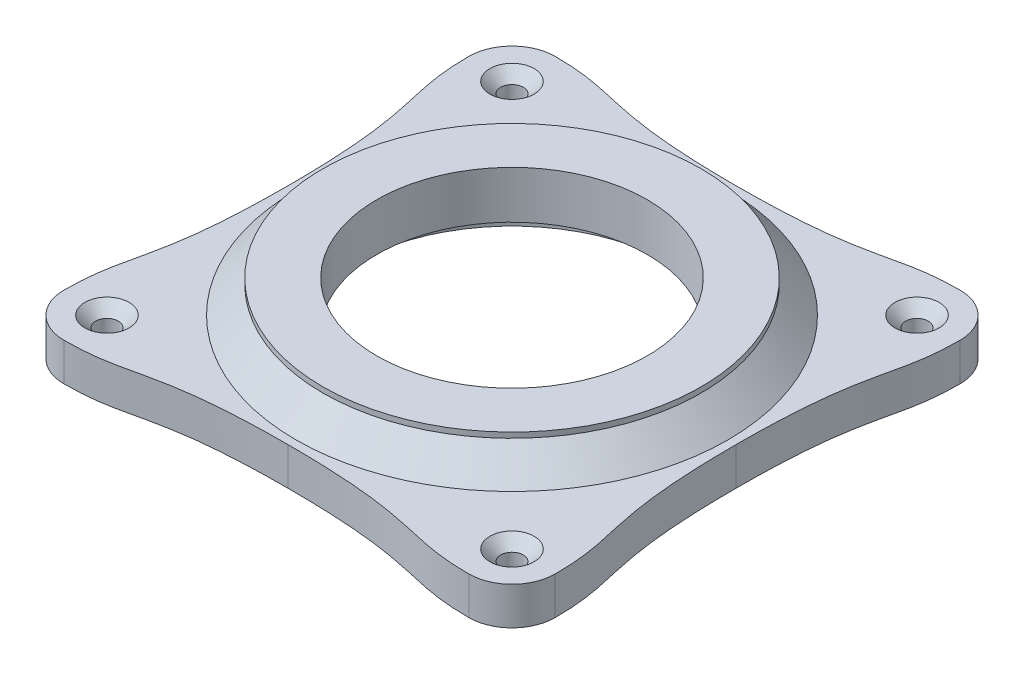
ISO-10303-21;
HEADER;
FILE_DESCRIPTION(('STEP AP214'),'2;1');
FILE_NAME('part.step','',(''),(''),'','','');
FILE_SCHEMA(('AUTOMOTIVE_DESIGN { 1 0 10303 214 1 1 1 1 }'));
ENDSEC;
DATA;
#1=APPLICATION_CONTEXT('core data for automotive mechanical design processes');
#2=APPLICATION_PROTOCOL_DEFINITION('international standard','automotive_design',2000,#1);
#3=PRODUCT_CONTEXT('',#1,'mechanical');
#4=PRODUCT('Part','Part','',(#3));
#5=PRODUCT_RELATED_PRODUCT_CATEGORY('part','',(#4));
#6=PRODUCT_DEFINITION_FORMATION('','',#4);
#7=PRODUCT_DEFINITION_CONTEXT('part definition',#1,'design');
#8=PRODUCT_DEFINITION('design','',#6,#7);
#9=PRODUCT_DEFINITION_SHAPE('','',#8);
#10=(LENGTH_UNIT() NAMED_UNIT(*) SI_UNIT(.MILLI.,.METRE.));
#11=(NAMED_UNIT(*) PLANE_ANGLE_UNIT() SI_UNIT($,.RADIAN.));
#12=(NAMED_UNIT(*) SI_UNIT($,.STERADIAN.) SOLID_ANGLE_UNIT());
#13=UNCERTAINTY_MEASURE_WITH_UNIT(LENGTH_MEASURE(1.E-05),#10,'distance_accuracy_value','');
#14=(GEOMETRIC_REPRESENTATION_CONTEXT(3) GLOBAL_UNCERTAINTY_ASSIGNED_CONTEXT((#13)) GLOBAL_UNIT_ASSIGNED_CONTEXT((#10,
#11,#12)) REPRESENTATION_CONTEXT('',''));
#15=CARTESIAN_POINT('',(0.,0.,0.));
#16=DIRECTION('',(0.,0.,1.));
#17=DIRECTION('',(1.,0.,0.));
#18=AXIS2_PLACEMENT_3D('',#15,#16,#17);
#19=CARTESIAN_POINT('',(0.,7.,0.));
#20=DIRECTION('',(0.,1.,0.));
#21=DIRECTION('',(0.,0.,1.));
#22=AXIS2_PLACEMENT_3D('',#19,#20,#21);
#23=PLANE('',#22);
#24=CARTESIAN_POINT('',(37.5,7.,-37.5));
#25=DIRECTION('',(0.,1.,0.));
#26=DIRECTION('',(0.,0.,1.));
#27=AXIS2_PLACEMENT_3D('',#24,#25,#26);
#28=CIRCLE('',#27,39.9999999999999);
#29=CARTESIAN_POINT('',(37.5,7.,2.49999999999993));
#30=VERTEX_POINT('',#29);
#31=EDGE_CURVE('E11',#30,#30,#28,.F.);
#32=ORIENTED_EDGE('',*,*,#31,.T.);
#33=EDGE_LOOP('',(#32));
#34=FACE_BOUND('',#33,.T.);
#35=CARTESIAN_POINT('',(0.,7.,-75.));
#36=DIRECTION('',(0.,1.,0.));
#37=DIRECTION('',(0.,0.,1.));
#38=AXIS2_PLACEMENT_3D('',#35,#36,#37);
#39=CIRCLE('',#38,4.10000000000002);
#40=CARTESIAN_POINT('',(0.,7.,-70.9));
#41=VERTEX_POINT('',#40);
#42=EDGE_CURVE('E307',#41,#41,#39,.F.);
#43=ORIENTED_EDGE('',*,*,#42,.T.);
#44=EDGE_LOOP('',(#43));
#45=FACE_BOUND('',#44,.T.);
#46=CARTESIAN_POINT('',(0.,7.,0.));
#47=DIRECTION('',(0.,1.,0.));
#48=DIRECTION('',(0.,0.,1.));
#49=AXIS2_PLACEMENT_3D('',#46,#47,#48);
#50=CIRCLE('',#49,4.10000000000006);
#51=CARTESIAN_POINT('',(0.,7.,4.10000000000006));
#52=VERTEX_POINT('',#51);
#53=EDGE_CURVE('E304',#52,#52,#50,.F.);
#54=ORIENTED_EDGE('',*,*,#53,.T.);
#55=EDGE_LOOP('',(#54));
#56=FACE_BOUND('',#55,.T.);
#57=CARTESIAN_POINT('',(75.,7.,0.));
#58=DIRECTION('',(0.,1.,0.));
#59=DIRECTION('',(0.,0.,1.));
#60=AXIS2_PLACEMENT_3D('',#57,#58,#59);
#61=CIRCLE('',#60,4.10000000000006);
#62=CARTESIAN_POINT('',(75.,7.,4.10000000000006));
#63=VERTEX_POINT('',#62);
#64=EDGE_CURVE('E301',#63,#63,#61,.F.);
#65=ORIENTED_EDGE('',*,*,#64,.T.);
#66=EDGE_LOOP('',(#65));
#67=FACE_BOUND('',#66,.T.);
#68=CARTESIAN_POINT('',(75.0000000000007,7.,-75.0000000000004));
#69=DIRECTION('',(0.,1.,0.));
#70=DIRECTION('',(0.,0.,1.));
#71=AXIS2_PLACEMENT_3D('',#68,#69,#70);
#72=CIRCLE('',#71,4.09999999999928);
#73=CARTESIAN_POINT('',(75.0000000000007,7.,-70.9000000000011));
#74=VERTEX_POINT('',#73);
#75=EDGE_CURVE('E298',#74,#74,#72,.F.);
#76=ORIENTED_EDGE('',*,*,#75,.T.);
#77=EDGE_LOOP('',(#76));
#78=FACE_BOUND('',#77,.T.);
#79=CARTESIAN_POINT('',(0.,7.,-75.));
#80=DIRECTION('',(0.,1.,0.));
#81=DIRECTION('',(0.,0.,1.));
#82=AXIS2_PLACEMENT_3D('',#79,#80,#81);
#83=CIRCLE('',#82,8.);
#84=CARTESIAN_POINT('',(0.,7.,-83.));
#85=VERTEX_POINT('',#84);
#86=CARTESIAN_POINT('',(-8.,7.,-75.));
#87=VERTEX_POINT('',#86);
#88=EDGE_CURVE('E385',#85,#87,#83,.T.);
#89=ORIENTED_EDGE('',*,*,#88,.T.);
#90=CARTESIAN_POINT('',(-7.99999999999906,7.,-74.9999999999999));
#91=CARTESIAN_POINT('',(-7.99999999999922,7.,-62.4999999999999));
#92=CARTESIAN_POINT('',(-4.,7.,-62.5));
#93=CARTESIAN_POINT('',(-4.,7.,-37.5));
#94=B_SPLINE_CURVE_WITH_KNOTS('',3,(#90,#91,#92,#93),.UNSPECIFIED.,.F.,.F.,(4,4),(0.,1.),.UNSPECIFIED.);
#95=CARTESIAN_POINT('',(-4.,7.,-37.5));
#96=VERTEX_POINT('',#95);
#97=EDGE_CURVE('E107',#87,#96,#94,.T.);
#98=ORIENTED_EDGE('',*,*,#97,.T.);
#99=CARTESIAN_POINT('',(-7.99999999999987,7.,0.));
#100=CARTESIAN_POINT('',(-7.99999999999974,7.,-12.4999999999999));
#101=CARTESIAN_POINT('',(-4.00000000000002,7.,-12.5));
#102=CARTESIAN_POINT('',(-4.,7.,-37.5));
#103=B_SPLINE_CURVE_WITH_KNOTS('',3,(#99,#100,#101,#102),.UNSPECIFIED.,.F.,.F.,(4,4),(0.,1.),.UNSPECIFIED.);
#104=CARTESIAN_POINT('',(-7.99999999999915,7.,-2.93902320845243E-13));
#105=VERTEX_POINT('',#104);
#106=EDGE_CURVE('E236',#105,#96,#103,.T.);
#107=ORIENTED_EDGE('',*,*,#106,.F.);
#108=CARTESIAN_POINT('',(8.46545056276682E-13,7.,-2.4980018054066E-13));
#109=DIRECTION('',(0.,1.,0.));
#110=DIRECTION('',(0.,0.,1.));
#111=AXIS2_PLACEMENT_3D('',#108,#109,#110);
#112=CIRCLE('',#111,8.);
#113=CARTESIAN_POINT('',(8.46545056276682E-13,7.,7.99999999999975));
#114=VERTEX_POINT('',#113);
#115=EDGE_CURVE('E241',#105,#114,#112,.T.);
#116=ORIENTED_EDGE('',*,*,#115,.T.);
#117=CARTESIAN_POINT('',(7.91033905045424E-13,7.,7.99999999999974));
#118=CARTESIAN_POINT('',(12.5000000000008,7.,7.99999999999985));
#119=CARTESIAN_POINT('',(12.5,7.,4.00000000000005));
#120=CARTESIAN_POINT('',(37.5,7.,4.00000000000003));
#121=B_SPLINE_CURVE_WITH_KNOTS('',3,(#117,#118,#119,#120),.UNSPECIFIED.,.F.,.F.,(4,4),(0.,1.),.UNSPECIFIED.);
#122=CARTESIAN_POINT('',(37.5,7.,4.00000000000003));
#123=VERTEX_POINT('',#122);
#124=EDGE_CURVE('E206',#114,#123,#121,.T.);
#125=ORIENTED_EDGE('',*,*,#124,.T.);
#126=CARTESIAN_POINT('',(75.0000000000008,7.,8.00000000000028));
#127=CARTESIAN_POINT('',(62.5000000000008,7.,8.0000000000002));
#128=CARTESIAN_POINT('',(62.5,7.,4.00000000000003));
#129=CARTESIAN_POINT('',(37.5,7.,4.00000000000003));
#130=B_SPLINE_CURVE_WITH_KNOTS('',3,(#126,#127,#128,#129),.UNSPECIFIED.,.F.,.F.,(4,4),(0.,1.),.UNSPECIFIED.);
#131=CARTESIAN_POINT('',(75.0000000000005,7.,7.99999999999959));
#132=VERTEX_POINT('',#131);
#133=EDGE_CURVE('E200',#132,#123,#130,.T.);
#134=ORIENTED_EDGE('',*,*,#133,.F.);
#135=CARTESIAN_POINT('',(75.0000000000005,7.,-4.02455846426619E-13));
#136=DIRECTION('',(0.,1.,0.));
#137=DIRECTION('',(0.,0.,1.));
#138=AXIS2_PLACEMENT_3D('',#135,#136,#137);
#139=CIRCLE('',#138,7.99999999999999);
#140=CARTESIAN_POINT('',(83.0000000000005,7.,-3.73544278276556E-13));
#141=VERTEX_POINT('',#140);
#142=EDGE_CURVE('E195',#132,#141,#139,.T.);
#143=ORIENTED_EDGE('',*,*,#142,.T.);
#144=CARTESIAN_POINT('',(83.0000000000004,7.,-3.7470027081099E-13));
#145=CARTESIAN_POINT('',(83.0000000000005,7.,-12.5000000000004));
#146=CARTESIAN_POINT('',(79.,7.,-12.5));
#147=CARTESIAN_POINT('',(79.,7.,-37.5));
#148=B_SPLINE_CURVE_WITH_KNOTS('',3,(#144,#145,#146,#147),.UNSPECIFIED.,.F.,.F.,(4,4),(0.,1.),.UNSPECIFIED.);
#149=CARTESIAN_POINT('',(79.,7.,-37.5));
#150=VERTEX_POINT('',#149);
#151=EDGE_CURVE('E187',#141,#150,#148,.T.);
#152=ORIENTED_EDGE('',*,*,#151,.T.);
#153=CARTESIAN_POINT('',(83.0000000000007,7.,-75.0000000000004));
#154=CARTESIAN_POINT('',(83.0000000000007,7.,-62.5000000000004));
#155=CARTESIAN_POINT('',(79.,7.,-62.5));
#156=CARTESIAN_POINT('',(79.,7.,-37.5));
#157=B_SPLINE_CURVE_WITH_KNOTS('',3,(#153,#154,#155,#156),.UNSPECIFIED.,.F.,.F.,(4,4),(0.,1.),.UNSPECIFIED.);
#158=CARTESIAN_POINT('',(83.0000000000002,7.,-75.));
#159=VERTEX_POINT('',#158);
#160=EDGE_CURVE('E141',#159,#150,#157,.T.);
#161=ORIENTED_EDGE('',*,*,#160,.F.);
#162=CARTESIAN_POINT('',(75.0000000000007,7.,-75.0000000000004));
#163=DIRECTION('',(0.,1.,0.));
#164=DIRECTION('',(0.,0.,1.));
#165=AXIS2_PLACEMENT_3D('',#162,#163,#164);
#166=CIRCLE('',#165,7.99999999999945);
#167=CARTESIAN_POINT('',(75.,7.,-82.9999999999999));
#168=VERTEX_POINT('',#167);
#169=EDGE_CURVE('E135',#159,#168,#166,.T.);
#170=ORIENTED_EDGE('',*,*,#169,.T.);
#171=CARTESIAN_POINT('',(75.,7.,-83.));
#172=CARTESIAN_POINT('',(62.5,7.,-83.));
#173=CARTESIAN_POINT('',(62.5,7.,-79.));
#174=CARTESIAN_POINT('',(37.5,7.,-79.));
#175=B_SPLINE_CURVE_WITH_KNOTS('',3,(#171,#172,#173,#174),.UNSPECIFIED.,.F.,.F.,(4,4),(0.,1.),.UNSPECIFIED.);
#176=CARTESIAN_POINT('',(37.5,7.,-79.));
#177=VERTEX_POINT('',#176);
#178=EDGE_CURVE('E139',#168,#177,#175,.T.);
#179=ORIENTED_EDGE('',*,*,#178,.T.);
#180=CARTESIAN_POINT('',(0.,7.,-83.));
#181=CARTESIAN_POINT('',(12.5,7.,-83.));
#182=CARTESIAN_POINT('',(12.5,7.,-79.));
#183=CARTESIAN_POINT('',(37.5,7.,-79.));
#184=B_SPLINE_CURVE_WITH_KNOTS('',3,(#180,#181,#182,#183),.UNSPECIFIED.,.F.,.F.,(4,4),(0.,1.),.UNSPECIFIED.);
#185=EDGE_CURVE('E154',#85,#177,#184,.T.);
#186=ORIENTED_EDGE('',*,*,#185,.F.);
#187=EDGE_LOOP('',(#89,#98,#107,#116,#125,#134,#143,#152,#161,#170,#179,#186));
#188=FACE_BOUND('',#187,.T.);
#189=ADVANCED_FACE('F37',(#34,#45,#56,#67,#78,#188),#23,.T.);
#190=CARTESIAN_POINT('',(37.5,7.,-37.5));
#191=DIRECTION('',(0.,-1.,0.));
#192=DIRECTION('',(0.,0.,-1.));
#193=AXIS2_PLACEMENT_3D('',#190,#191,#192);
#194=CYLINDRICAL_SURFACE('',#193,25.05);
#195=CARTESIAN_POINT('',(37.5,4.2,-37.5));
#196=DIRECTION('',(0.,-1.,0.));
#197=DIRECTION('',(0.,0.,-1.));
#198=AXIS2_PLACEMENT_3D('',#195,#196,#197);
#199=CIRCLE('',#198,25.05);
#200=CARTESIAN_POINT('',(37.5,4.2,-62.55));
#201=VERTEX_POINT('',#200);
#202=EDGE_CURVE('E450',#201,#201,#199,.T.);
#203=ORIENTED_EDGE('',*,*,#202,.T.);
#204=EDGE_LOOP('',(#203));
#205=FACE_BOUND('',#204,.T.);
#206=CARTESIAN_POINT('',(37.5,13.,-37.5));
#207=DIRECTION('',(0.,1.,0.));
#208=DIRECTION('',(0.,0.,1.));
#209=AXIS2_PLACEMENT_3D('',#206,#207,#208);
#210=CIRCLE('',#209,25.05);
#211=CARTESIAN_POINT('',(37.5,13.,-12.45));
#212=VERTEX_POINT('',#211);
#213=EDGE_CURVE('E458',#212,#212,#210,.T.);
#214=ORIENTED_EDGE('',*,*,#213,.T.);
#215=EDGE_LOOP('',(#214));
#216=FACE_BOUND('',#215,.T.);
#217=ADVANCED_FACE('F334',(#205,#216),#194,.F.);
#218=CARTESIAN_POINT('',(0.,7.,-75.));
#219=DIRECTION('',(0.,-1.,0.));
#220=DIRECTION('',(0.,0.,-1.));
#221=AXIS2_PLACEMENT_3D('',#218,#219,#220);
#222=CYLINDRICAL_SURFACE('',#221,8.);
#223=CARTESIAN_POINT('',(0.,0.,-75.));
#224=DIRECTION('',(0.,1.,0.));
#225=DIRECTION('',(0.,0.,1.));
#226=AXIS2_PLACEMENT_3D('',#223,#224,#225);
#227=CIRCLE('',#226,8.);
#228=CARTESIAN_POINT('',(0.,0.,-83.));
#229=VERTEX_POINT('',#228);
#230=CARTESIAN_POINT('',(-8.,0.,-75.));
#231=VERTEX_POINT('',#230);
#232=EDGE_CURVE('E378',#229,#231,#227,.T.);
#233=ORIENTED_EDGE('',*,*,#232,.T.);
#234=DIRECTION('',(0.,-1.,0.));
#235=VECTOR('',#234,1.);
#236=CARTESIAN_POINT('',(-8.,7.,-75.));
#237=LINE('',#236,#235);
#238=EDGE_CURVE('E293',#87,#231,#237,.T.);
#239=ORIENTED_EDGE('',*,*,#238,.F.);
#240=ORIENTED_EDGE('',*,*,#88,.F.);
#241=DIRECTION('',(0.,-1.,0.));
#242=VECTOR('',#241,1.);
#243=CARTESIAN_POINT('',(0.,7.,-83.));
#244=LINE('',#243,#242);
#245=EDGE_CURVE('E55',#85,#229,#244,.T.);
#246=ORIENTED_EDGE('',*,*,#245,.T.);
#247=EDGE_LOOP('',(#233,#239,#240,#246));
#248=FACE_BOUND('',#247,.T.);
#249=ADVANCED_FACE('F340',(#248),#222,.T.);
#250=DIRECTION('',(0.,-1.,0.));
#251=VECTOR('',#250,1.);
#252=SURFACE_OF_LINEAR_EXTRUSION('',#94,#251);
#253=CARTESIAN_POINT('',(-7.99999999999906,0.,-74.9999999999999));
#254=CARTESIAN_POINT('',(-7.99999999999922,0.,-62.4999999999999));
#255=CARTESIAN_POINT('',(-4.,0.,-62.5));
#256=CARTESIAN_POINT('',(-4.,0.,-37.5));
#257=B_SPLINE_CURVE_WITH_KNOTS('',3,(#253,#254,#255,#256),.UNSPECIFIED.,.F.,.F.,(4,4),(0.,1.),.UNSPECIFIED.);
#258=CARTESIAN_POINT('',(-4.,0.,-37.5));
#259=VERTEX_POINT('',#258);
#260=EDGE_CURVE('E382',#231,#259,#257,.T.);
#261=ORIENTED_EDGE('',*,*,#260,.T.);
#262=DIRECTION('',(0.,-1.,0.));
#263=VECTOR('',#262,1.);
#264=CARTESIAN_POINT('',(-4.,7.,-37.5));
#265=LINE('',#264,#263);
#266=EDGE_CURVE('E291',#96,#259,#265,.T.);
#267=ORIENTED_EDGE('',*,*,#266,.F.);
#268=ORIENTED_EDGE('',*,*,#97,.F.);
#269=ORIENTED_EDGE('',*,*,#238,.T.);
#270=EDGE_LOOP('',(#261,#267,#268,#269));
#271=FACE_BOUND('',#270,.T.);
#272=ADVANCED_FACE('F232',(#271),#252,.F.);
#273=DIRECTION('',(0.,-1.,0.));
#274=VECTOR('',#273,1.);
#275=SURFACE_OF_LINEAR_EXTRUSION('',#103,#274);
#276=CARTESIAN_POINT('',(-7.99999999999987,0.,0.));
#277=CARTESIAN_POINT('',(-7.99999999999974,0.,-12.4999999999999));
#278=CARTESIAN_POINT('',(-4.00000000000002,0.,-12.5));
#279=CARTESIAN_POINT('',(-4.,0.,-37.5));
#280=B_SPLINE_CURVE_WITH_KNOTS('',3,(#276,#277,#278,#279),.UNSPECIFIED.,.F.,.F.,(4,4),(0.,1.),.UNSPECIFIED.);
#281=CARTESIAN_POINT('',(-7.99999999999915,0.,-2.93902320845243E-13));
#282=VERTEX_POINT('',#281);
#283=EDGE_CURVE('E430',#282,#259,#280,.T.);
#284=ORIENTED_EDGE('',*,*,#283,.F.);
#285=DIRECTION('',(0.,-1.,0.));
#286=VECTOR('',#285,1.);
#287=CARTESIAN_POINT('',(-7.99999999999915,7.,-2.93902320845243E-13));
#288=LINE('',#287,#286);
#289=EDGE_CURVE('E289',#105,#282,#288,.T.);
#290=ORIENTED_EDGE('',*,*,#289,.F.);
#291=ORIENTED_EDGE('',*,*,#106,.T.);
#292=ORIENTED_EDGE('',*,*,#266,.T.);
#293=EDGE_LOOP('',(#284,#290,#291,#292));
#294=FACE_BOUND('',#293,.T.);
#295=ADVANCED_FACE('F227',(#294),#275,.T.);
#296=CARTESIAN_POINT('',(8.46545056276682E-13,7.,-2.4980018054066E-13));
#297=DIRECTION('',(0.,-1.,0.));
#298=DIRECTION('',(0.,0.,-1.));
#299=AXIS2_PLACEMENT_3D('',#296,#297,#298);
#300=CYLINDRICAL_SURFACE('',#299,8.);
#301=CARTESIAN_POINT('',(8.46545056276682E-13,0.,-2.4980018054066E-13));
#302=DIRECTION('',(0.,1.,0.));
#303=DIRECTION('',(0.,0.,1.));
#304=AXIS2_PLACEMENT_3D('',#301,#302,#303);
#305=CIRCLE('',#304,8.);
#306=CARTESIAN_POINT('',(8.46545056276682E-13,0.,7.99999999999975));
#307=VERTEX_POINT('',#306);
#308=EDGE_CURVE('E425',#282,#307,#305,.T.);
#309=ORIENTED_EDGE('',*,*,#308,.T.);
#310=DIRECTION('',(0.,-1.,0.));
#311=VECTOR('',#310,1.);
#312=CARTESIAN_POINT('',(8.46545056276682E-13,7.,7.99999999999975));
#313=LINE('',#312,#311);
#314=EDGE_CURVE('E262',#114,#307,#313,.T.);
#315=ORIENTED_EDGE('',*,*,#314,.F.);
#316=ORIENTED_EDGE('',*,*,#115,.F.);
#317=ORIENTED_EDGE('',*,*,#289,.T.);
#318=EDGE_LOOP('',(#309,#315,#316,#317));
#319=FACE_BOUND('',#318,.T.);
#320=ADVANCED_FACE('F223',(#319),#300,.T.);
#321=DIRECTION('',(0.,-1.,0.));
#322=VECTOR('',#321,1.);
#323=SURFACE_OF_LINEAR_EXTRUSION('',#121,#322);
#324=CARTESIAN_POINT('',(7.91033905045424E-13,0.,7.99999999999974));
#325=CARTESIAN_POINT('',(12.5000000000008,0.,7.99999999999985));
#326=CARTESIAN_POINT('',(12.5,0.,4.00000000000005));
#327=CARTESIAN_POINT('',(37.5,0.,4.00000000000003));
#328=B_SPLINE_CURVE_WITH_KNOTS('',3,(#324,#325,#326,#327),.UNSPECIFIED.,.F.,.F.,(4,4),(0.,1.),.UNSPECIFIED.);
#329=CARTESIAN_POINT('',(37.5,0.,4.00000000000003));
#330=VERTEX_POINT('',#329);
#331=EDGE_CURVE('E259',#307,#330,#328,.T.);
#332=ORIENTED_EDGE('',*,*,#331,.T.);
#333=DIRECTION('',(0.,-1.,0.));
#334=VECTOR('',#333,1.);
#335=CARTESIAN_POINT('',(37.5,7.,4.00000000000003));
#336=LINE('',#335,#334);
#337=EDGE_CURVE('E257',#123,#330,#336,.T.);
#338=ORIENTED_EDGE('',*,*,#337,.F.);
#339=ORIENTED_EDGE('',*,*,#124,.F.);
#340=ORIENTED_EDGE('',*,*,#314,.T.);
#341=EDGE_LOOP('',(#332,#338,#339,#340));
#342=FACE_BOUND('',#341,.T.);
#343=ADVANCED_FACE('F219',(#342),#323,.F.);
#344=DIRECTION('',(0.,-1.,0.));
#345=VECTOR('',#344,1.);
#346=SURFACE_OF_LINEAR_EXTRUSION('',#130,#345);
#347=CARTESIAN_POINT('',(75.0000000000008,0.,8.00000000000028));
#348=CARTESIAN_POINT('',(62.5000000000008,0.,8.0000000000002));
#349=CARTESIAN_POINT('',(62.5,0.,4.00000000000003));
#350=CARTESIAN_POINT('',(37.5,0.,4.00000000000003));
#351=B_SPLINE_CURVE_WITH_KNOTS('',3,(#347,#348,#349,#350),.UNSPECIFIED.,.F.,.F.,(4,4),(0.,1.),.UNSPECIFIED.);
#352=CARTESIAN_POINT('',(75.0000000000005,0.,7.99999999999959));
#353=VERTEX_POINT('',#352);
#354=EDGE_CURVE('E266',#353,#330,#351,.T.);
#355=ORIENTED_EDGE('',*,*,#354,.F.);
#356=DIRECTION('',(0.,-1.,0.));
#357=VECTOR('',#356,1.);
#358=CARTESIAN_POINT('',(75.0000000000005,7.,7.99999999999959));
#359=LINE('',#358,#357);
#360=EDGE_CURVE('E263',#132,#353,#359,.T.);
#361=ORIENTED_EDGE('',*,*,#360,.F.);
#362=ORIENTED_EDGE('',*,*,#133,.T.);
#363=ORIENTED_EDGE('',*,*,#337,.T.);
#364=EDGE_LOOP('',(#355,#361,#362,#363));
#365=FACE_BOUND('',#364,.T.);
#366=ADVANCED_FACE('F215',(#365),#346,.T.);
#367=CARTESIAN_POINT('',(75.0000000000005,7.,-4.02455846426619E-13));
#368=DIRECTION('',(0.,-1.,0.));
#369=DIRECTION('',(0.,0.,-1.));
#370=AXIS2_PLACEMENT_3D('',#367,#368,#369);
#371=CYLINDRICAL_SURFACE('',#370,7.99999999999999);
#372=CARTESIAN_POINT('',(75.0000000000005,0.,-4.02455846426619E-13));
#373=DIRECTION('',(0.,1.,0.));
#374=DIRECTION('',(0.,0.,1.));
#375=AXIS2_PLACEMENT_3D('',#372,#373,#374);
#376=CIRCLE('',#375,7.99999999999999);
#377=CARTESIAN_POINT('',(83.0000000000005,0.,-3.73544278276556E-13));
#378=VERTEX_POINT('',#377);
#379=EDGE_CURVE('E411',#353,#378,#376,.T.);
#380=ORIENTED_EDGE('',*,*,#379,.T.);
#381=DIRECTION('',(0.,-1.,0.));
#382=VECTOR('',#381,1.);
#383=CARTESIAN_POINT('',(83.0000000000005,7.,-3.73544278276556E-13));
#384=LINE('',#383,#382);
#385=EDGE_CURVE('E269',#141,#378,#384,.T.);
#386=ORIENTED_EDGE('',*,*,#385,.F.);
#387=ORIENTED_EDGE('',*,*,#142,.F.);
#388=ORIENTED_EDGE('',*,*,#360,.T.);
#389=EDGE_LOOP('',(#380,#386,#387,#388));
#390=FACE_BOUND('',#389,.T.);
#391=ADVANCED_FACE('F218',(#390),#371,.T.);
#392=DIRECTION('',(0.,-1.,0.));
#393=VECTOR('',#392,1.);
#394=SURFACE_OF_LINEAR_EXTRUSION('',#148,#393);
#395=CARTESIAN_POINT('',(83.0000000000004,0.,-3.7470027081099E-13));
#396=CARTESIAN_POINT('',(83.0000000000005,0.,-12.5000000000004));
#397=CARTESIAN_POINT('',(79.,0.,-12.5));
#398=CARTESIAN_POINT('',(79.,0.,-37.5));
#399=B_SPLINE_CURVE_WITH_KNOTS('',3,(#395,#396,#397,#398),.UNSPECIFIED.,.F.,.F.,(4,4),(0.,1.),.UNSPECIFIED.);
#400=CARTESIAN_POINT('',(79.,0.,-37.5));
#401=VERTEX_POINT('',#400);
#402=EDGE_CURVE('E279',#378,#401,#399,.T.);
#403=ORIENTED_EDGE('',*,*,#402,.T.);
#404=DIRECTION('',(0.,-1.,0.));
#405=VECTOR('',#404,1.);
#406=CARTESIAN_POINT('',(79.,7.,-37.5));
#407=LINE('',#406,#405);
#408=EDGE_CURVE('E277',#150,#401,#407,.T.);
#409=ORIENTED_EDGE('',*,*,#408,.F.);
#410=ORIENTED_EDGE('',*,*,#151,.F.);
#411=ORIENTED_EDGE('',*,*,#385,.T.);
#412=EDGE_LOOP('',(#403,#409,#410,#411));
#413=FACE_BOUND('',#412,.T.);
#414=ADVANCED_FACE('F180',(#413),#394,.F.);
#415=DIRECTION('',(0.,-1.,0.));
#416=VECTOR('',#415,1.);
#417=SURFACE_OF_LINEAR_EXTRUSION('',#157,#416);
#418=CARTESIAN_POINT('',(83.0000000000007,0.,-75.0000000000004));
#419=CARTESIAN_POINT('',(83.0000000000007,0.,-62.5000000000004));
#420=CARTESIAN_POINT('',(79.,0.,-62.5));
#421=CARTESIAN_POINT('',(79.,0.,-37.5));
#422=B_SPLINE_CURVE_WITH_KNOTS('',3,(#418,#419,#420,#421),.UNSPECIFIED.,.F.,.F.,(4,4),(0.,1.),.UNSPECIFIED.);
#423=CARTESIAN_POINT('',(83.0000000000002,0.,-75.));
#424=VERTEX_POINT('',#423);
#425=EDGE_CURVE('E283',#424,#401,#422,.T.);
#426=ORIENTED_EDGE('',*,*,#425,.F.);
#427=DIRECTION('',(0.,-1.,0.));
#428=VECTOR('',#427,1.);
#429=CARTESIAN_POINT('',(83.0000000000002,7.,-75.));
#430=LINE('',#429,#428);
#431=EDGE_CURVE('E151',#159,#424,#430,.T.);
#432=ORIENTED_EDGE('',*,*,#431,.F.);
#433=ORIENTED_EDGE('',*,*,#160,.T.);
#434=ORIENTED_EDGE('',*,*,#408,.T.);
#435=EDGE_LOOP('',(#426,#432,#433,#434));
#436=FACE_BOUND('',#435,.T.);
#437=ADVANCED_FACE('F177',(#436),#417,.T.);
#438=CARTESIAN_POINT('',(75.0000000000007,7.,-75.0000000000004));
#439=DIRECTION('',(0.,-1.,0.));
#440=DIRECTION('',(0.,0.,-1.));
#441=AXIS2_PLACEMENT_3D('',#438,#439,#440);
#442=CYLINDRICAL_SURFACE('',#441,7.99999999999945);
#443=CARTESIAN_POINT('',(75.0000000000007,0.,-75.0000000000004));
#444=DIRECTION('',(0.,1.,0.));
#445=DIRECTION('',(0.,0.,1.));
#446=AXIS2_PLACEMENT_3D('',#443,#444,#445);
#447=CIRCLE('',#446,7.99999999999945);
#448=CARTESIAN_POINT('',(75.,0.,-82.9999999999999));
#449=VERTEX_POINT('',#448);
#450=EDGE_CURVE('E148',#424,#449,#447,.T.);
#451=ORIENTED_EDGE('',*,*,#450,.T.);
#452=DIRECTION('',(0.,-1.,0.));
#453=VECTOR('',#452,1.);
#454=CARTESIAN_POINT('',(75.,7.,-82.9999999999999));
#455=LINE('',#454,#453);
#456=EDGE_CURVE('E145',#168,#449,#455,.T.);
#457=ORIENTED_EDGE('',*,*,#456,.F.);
#458=ORIENTED_EDGE('',*,*,#169,.F.);
#459=ORIENTED_EDGE('',*,*,#431,.T.);
#460=EDGE_LOOP('',(#451,#457,#458,#459));
#461=FACE_BOUND('',#460,.T.);
#462=ADVANCED_FACE('F146',(#461),#442,.T.);
#463=DIRECTION('',(0.,-1.,0.));
#464=VECTOR('',#463,1.);
#465=SURFACE_OF_LINEAR_EXTRUSION('',#175,#464);
#466=CARTESIAN_POINT('',(75.,0.,-83.));
#467=CARTESIAN_POINT('',(62.5,0.,-83.));
#468=CARTESIAN_POINT('',(62.5,0.,-79.));
#469=CARTESIAN_POINT('',(37.5,0.,-79.));
#470=B_SPLINE_CURVE_WITH_KNOTS('',3,(#466,#467,#468,#469),.UNSPECIFIED.,.F.,.F.,(4,4),(0.,1.),.UNSPECIFIED.);
#471=CARTESIAN_POINT('',(37.5,0.,-79.));
#472=VERTEX_POINT('',#471);
#473=EDGE_CURVE('E386',#449,#472,#470,.T.);
#474=ORIENTED_EDGE('',*,*,#473,.T.);
#475=DIRECTION('',(0.,-1.,0.));
#476=VECTOR('',#475,1.);
#477=CARTESIAN_POINT('',(37.5,7.,-79.));
#478=LINE('',#477,#476);
#479=EDGE_CURVE('E94',#177,#472,#478,.T.);
#480=ORIENTED_EDGE('',*,*,#479,.F.);
#481=ORIENTED_EDGE('',*,*,#178,.F.);
#482=ORIENTED_EDGE('',*,*,#456,.T.);
#483=EDGE_LOOP('',(#474,#480,#481,#482));
#484=FACE_BOUND('',#483,.T.);
#485=ADVANCED_FACE('F153',(#484),#465,.F.);
#486=CARTESIAN_POINT('',(0.,7.,0.));
#487=DIRECTION('',(0.,-1.,0.));
#488=DIRECTION('',(0.,0.,-1.));
#489=AXIS2_PLACEMENT_3D('',#486,#487,#488);
#490=CYLINDRICAL_SURFACE('',#489,2.1);
#491=CARTESIAN_POINT('',(0.,4.99999999999996,0.));
#492=DIRECTION('',(0.,1.,0.));
#493=DIRECTION('',(0.,0.,1.));
#494=AXIS2_PLACEMENT_3D('',#491,#492,#493);
#495=CIRCLE('',#494,2.1);
#496=CARTESIAN_POINT('',(0.,4.99999999999996,2.1));
#497=VERTEX_POINT('',#496);
#498=EDGE_CURVE('E310',#497,#497,#495,.T.);
#499=ORIENTED_EDGE('',*,*,#498,.T.);
#500=EDGE_LOOP('',(#499));
#501=FACE_BOUND('',#500,.T.);
#502=CARTESIAN_POINT('',(0.,0.,0.));
#503=DIRECTION('',(0.,1.,0.));
#504=DIRECTION('',(0.,0.,1.));
#505=AXIS2_PLACEMENT_3D('',#502,#503,#504);
#506=CIRCLE('',#505,2.1);
#507=CARTESIAN_POINT('',(0.,0.,2.1));
#508=VERTEX_POINT('',#507);
#509=EDGE_CURVE('E376',#508,#508,#506,.T.);
#510=ORIENTED_EDGE('',*,*,#509,.F.);
#511=EDGE_LOOP('',(#510));
#512=FACE_BOUND('',#511,.T.);
#513=ADVANCED_FACE('F172',(#501,#512),#490,.F.);
#514=CARTESIAN_POINT('',(75.,7.,0.));
#515=DIRECTION('',(0.,-1.,0.));
#516=DIRECTION('',(0.,0.,-1.));
#517=AXIS2_PLACEMENT_3D('',#514,#515,#516);
#518=CYLINDRICAL_SURFACE('',#517,2.1);
#519=CARTESIAN_POINT('',(75.,4.99999999999996,0.));
#520=DIRECTION('',(0.,1.,0.));
#521=DIRECTION('',(0.,0.,1.));
#522=AXIS2_PLACEMENT_3D('',#519,#520,#521);
#523=CIRCLE('',#522,2.1);
#524=CARTESIAN_POINT('',(75.,4.99999999999996,2.1));
#525=VERTEX_POINT('',#524);
#526=EDGE_CURVE('E313',#525,#525,#523,.T.);
#527=ORIENTED_EDGE('',*,*,#526,.T.);
#528=EDGE_LOOP('',(#527));
#529=FACE_BOUND('',#528,.T.);
#530=CARTESIAN_POINT('',(75.,0.,0.));
#531=DIRECTION('',(0.,1.,0.));
#532=DIRECTION('',(0.,0.,1.));
#533=AXIS2_PLACEMENT_3D('',#530,#531,#532);
#534=CIRCLE('',#533,2.1);
#535=CARTESIAN_POINT('',(75.,0.,2.1));
#536=VERTEX_POINT('',#535);
#537=EDGE_CURVE('E372',#536,#536,#534,.T.);
#538=ORIENTED_EDGE('',*,*,#537,.F.);
#539=EDGE_LOOP('',(#538));
#540=FACE_BOUND('',#539,.T.);
#541=ADVANCED_FACE('F590',(#529,#540),#518,.F.);
#542=CARTESIAN_POINT('',(75.0000000000007,7.,-75.0000000000004));
#543=DIRECTION('',(0.,-1.,0.));
#544=DIRECTION('',(0.,0.,-1.));
#545=AXIS2_PLACEMENT_3D('',#542,#543,#544);
#546=CYLINDRICAL_SURFACE('',#545,2.09999999999922);
#547=CARTESIAN_POINT('',(75.0000000000007,4.99999999999996,-75.0000000000004));
#548=DIRECTION('',(0.,1.,0.));
#549=DIRECTION('',(0.,0.,1.));
#550=AXIS2_PLACEMENT_3D('',#547,#548,#549);
#551=CIRCLE('',#550,2.09999999999922);
#552=CARTESIAN_POINT('',(75.0000000000007,4.99999999999996,-72.9000000000012));
#553=VERTEX_POINT('',#552);
#554=EDGE_CURVE('E316',#553,#553,#551,.T.);
#555=ORIENTED_EDGE('',*,*,#554,.T.);
#556=EDGE_LOOP('',(#555));
#557=FACE_BOUND('',#556,.T.);
#558=CARTESIAN_POINT('',(75.0000000000007,0.,-75.0000000000004));
#559=DIRECTION('',(0.,1.,0.));
#560=DIRECTION('',(0.,0.,1.));
#561=AXIS2_PLACEMENT_3D('',#558,#559,#560);
#562=CIRCLE('',#561,2.09999999999922);
#563=CARTESIAN_POINT('',(75.0000000000007,0.,-72.9000000000012));
#564=VERTEX_POINT('',#563);
#565=EDGE_CURVE('E368',#564,#564,#562,.T.);
#566=ORIENTED_EDGE('',*,*,#565,.F.);
#567=EDGE_LOOP('',(#566));
#568=FACE_BOUND('',#567,.T.);
#569=ADVANCED_FACE('F600',(#557,#568),#546,.F.);
#570=CARTESIAN_POINT('',(0.,7.,-75.));
#571=DIRECTION('',(0.,-1.,0.));
#572=DIRECTION('',(0.,0.,-1.));
#573=AXIS2_PLACEMENT_3D('',#570,#571,#572);
#574=CYLINDRICAL_SURFACE('',#573,2.1);
#575=CARTESIAN_POINT('',(0.,4.99999999999999,-75.));
#576=DIRECTION('',(0.,1.,0.));
#577=DIRECTION('',(0.,0.,1.));
#578=AXIS2_PLACEMENT_3D('',#575,#576,#577);
#579=CIRCLE('',#578,2.1);
#580=CARTESIAN_POINT('',(0.,4.99999999999999,-72.9));
#581=VERTEX_POINT('',#580);
#582=EDGE_CURVE('E295',#581,#581,#579,.T.);
#583=ORIENTED_EDGE('',*,*,#582,.T.);
#584=EDGE_LOOP('',(#583));
#585=FACE_BOUND('',#584,.T.);
#586=CARTESIAN_POINT('',(0.,0.,-75.));
#587=DIRECTION('',(0.,1.,0.));
#588=DIRECTION('',(0.,0.,1.));
#589=AXIS2_PLACEMENT_3D('',#586,#587,#588);
#590=CIRCLE('',#589,2.1);
#591=CARTESIAN_POINT('',(0.,0.,-72.9));
#592=VERTEX_POINT('',#591);
#593=EDGE_CURVE('E364',#592,#592,#590,.T.);
#594=ORIENTED_EDGE('',*,*,#593,.F.);
#595=EDGE_LOOP('',(#594));
#596=FACE_BOUND('',#595,.T.);
#597=ADVANCED_FACE('F356',(#585,#596),#574,.F.);
#598=DIRECTION('',(0.,-1.,0.));
#599=VECTOR('',#598,1.);
#600=SURFACE_OF_LINEAR_EXTRUSION('',#184,#599);
#601=CARTESIAN_POINT('',(0.,0.,-83.));
#602=CARTESIAN_POINT('',(12.5,0.,-83.));
#603=CARTESIAN_POINT('',(12.5,0.,-79.));
#604=CARTESIAN_POINT('',(37.5,0.,-79.));
#605=B_SPLINE_CURVE_WITH_KNOTS('',3,(#601,#602,#603,#604),.UNSPECIFIED.,.F.,.F.,(4,4),(0.,1.),.UNSPECIFIED.);
#606=EDGE_CURVE('E379',#229,#472,#605,.T.);
#607=ORIENTED_EDGE('',*,*,#606,.F.);
#608=ORIENTED_EDGE('',*,*,#245,.F.);
#609=ORIENTED_EDGE('',*,*,#185,.T.);
#610=ORIENTED_EDGE('',*,*,#479,.T.);
#611=EDGE_LOOP('',(#607,#608,#609,#610));
#612=FACE_BOUND('',#611,.T.);
#613=ADVANCED_FACE('F173',(#612),#600,.T.);
#614=CARTESIAN_POINT('',(0.,0.,0.));
#615=DIRECTION('',(0.,1.,0.));
#616=DIRECTION('',(0.,0.,1.));
#617=AXIS2_PLACEMENT_3D('',#614,#615,#616);
#618=PLANE('',#617);
#619=CARTESIAN_POINT('',(37.5,0.,-37.5));
#620=DIRECTION('',(0.,-1.,0.));
#621=DIRECTION('',(0.,0.,-1.));
#622=AXIS2_PLACEMENT_3D('',#619,#620,#621);
#623=CIRCLE('',#622,30.1);
#624=CARTESIAN_POINT('',(37.5,0.,-67.6));
#625=VERTEX_POINT('',#624);
#626=EDGE_CURVE('E360',#625,#625,#623,.T.);
#627=ORIENTED_EDGE('',*,*,#626,.F.);
#628=EDGE_LOOP('',(#627));
#629=FACE_BOUND('',#628,.T.);
#630=ORIENTED_EDGE('',*,*,#593,.T.);
#631=EDGE_LOOP('',(#630));
#632=FACE_BOUND('',#631,.T.);
#633=ORIENTED_EDGE('',*,*,#565,.T.);
#634=EDGE_LOOP('',(#633));
#635=FACE_BOUND('',#634,.T.);
#636=ORIENTED_EDGE('',*,*,#537,.T.);
#637=EDGE_LOOP('',(#636));
#638=FACE_BOUND('',#637,.T.);
#639=ORIENTED_EDGE('',*,*,#509,.T.);
#640=EDGE_LOOP('',(#639));
#641=FACE_BOUND('',#640,.T.);
#642=ORIENTED_EDGE('',*,*,#232,.F.);
#643=ORIENTED_EDGE('',*,*,#606,.T.);
#644=ORIENTED_EDGE('',*,*,#473,.F.);
#645=ORIENTED_EDGE('',*,*,#450,.F.);
#646=ORIENTED_EDGE('',*,*,#425,.T.);
#647=ORIENTED_EDGE('',*,*,#402,.F.);
#648=ORIENTED_EDGE('',*,*,#379,.F.);
#649=ORIENTED_EDGE('',*,*,#354,.T.);
#650=ORIENTED_EDGE('',*,*,#331,.F.);
#651=ORIENTED_EDGE('',*,*,#308,.F.);
#652=ORIENTED_EDGE('',*,*,#283,.T.);
#653=ORIENTED_EDGE('',*,*,#260,.F.);
#654=EDGE_LOOP('',(#642,#643,#644,#645,#646,#647,#648,#649,#650,#651,#652,#653));
#655=FACE_BOUND('',#654,.T.);
#656=ADVANCED_FACE('F347',(#629,#632,#635,#638,#641,#655),#618,.F.);
#657=CARTESIAN_POINT('',(37.5,4.2,-37.5));
#658=DIRECTION('',(0.,-1.,0.));
#659=DIRECTION('',(0.,0.,-1.));
#660=AXIS2_PLACEMENT_3D('',#657,#658,#659);
#661=CYLINDRICAL_SURFACE('',#660,30.1);
#662=CARTESIAN_POINT('',(37.5,4.2,-37.5));
#663=DIRECTION('',(0.,-1.,0.));
#664=DIRECTION('',(0.,0.,-1.));
#665=AXIS2_PLACEMENT_3D('',#662,#663,#664);
#666=CIRCLE('',#665,30.1);
#667=CARTESIAN_POINT('',(37.5,4.2,-67.6));
#668=VERTEX_POINT('',#667);
#669=EDGE_CURVE('E445',#668,#668,#666,.T.);
#670=ORIENTED_EDGE('',*,*,#669,.F.);
#671=EDGE_LOOP('',(#670));
#672=FACE_BOUND('',#671,.T.);
#673=ORIENTED_EDGE('',*,*,#626,.T.);
#674=EDGE_LOOP('',(#673));
#675=FACE_BOUND('',#674,.T.);
#676=ADVANCED_FACE('F345',(#672,#675),#661,.F.);
#677=CARTESIAN_POINT('',(37.5,4.2,-37.5));
#678=DIRECTION('',(0.,-1.,0.));
#679=DIRECTION('',(0.,0.,-1.));
#680=AXIS2_PLACEMENT_3D('',#677,#678,#679);
#681=PLANE('',#680);
#682=ORIENTED_EDGE('',*,*,#202,.F.);
#683=EDGE_LOOP('',(#682));
#684=FACE_BOUND('',#683,.T.);
#685=ORIENTED_EDGE('',*,*,#669,.T.);
#686=EDGE_LOOP('',(#685));
#687=FACE_BOUND('',#686,.T.);
#688=ADVANCED_FACE('F354',(#684,#687),#681,.T.);
#689=CARTESIAN_POINT('',(37.5,13.,-37.5));
#690=DIRECTION('',(0.,1.,0.));
#691=DIRECTION('',(0.,0.,1.));
#692=AXIS2_PLACEMENT_3D('',#689,#690,#691);
#693=PLANE('',#692);
#694=CARTESIAN_POINT('',(37.5,13.,-37.5));
#695=DIRECTION('',(0.,1.,0.));
#696=DIRECTION('',(0.,0.,1.));
#697=AXIS2_PLACEMENT_3D('',#694,#695,#696);
#698=CIRCLE('',#697,35.);
#699=CARTESIAN_POINT('',(37.5,13.,-2.5));
#700=VERTEX_POINT('',#699);
#701=EDGE_CURVE('E455',#700,#700,#698,.T.);
#702=ORIENTED_EDGE('',*,*,#701,.T.);
#703=EDGE_LOOP('',(#702));
#704=FACE_BOUND('',#703,.T.);
#705=ORIENTED_EDGE('',*,*,#213,.F.);
#706=EDGE_LOOP('',(#705));
#707=FACE_BOUND('',#706,.T.);
#708=ADVANCED_FACE('F463',(#704,#707),#693,.T.);
#709=CARTESIAN_POINT('',(37.5,13.,-37.5));
#710=DIRECTION('',(0.,-1.,0.));
#711=DIRECTION('',(0.,0.,-1.));
#712=AXIS2_PLACEMENT_3D('',#709,#710,#711);
#713=CYLINDRICAL_SURFACE('',#712,35.);
#714=CARTESIAN_POINT('',(37.5,12.,-37.5));
#715=DIRECTION('',(0.,1.,0.));
#716=DIRECTION('',(0.,0.,1.));
#717=AXIS2_PLACEMENT_3D('',#714,#715,#716);
#718=CIRCLE('',#717,35.);
#719=CARTESIAN_POINT('',(37.5,12.,-2.5));
#720=VERTEX_POINT('',#719);
#721=EDGE_CURVE('E47',#720,#720,#718,.T.);
#722=ORIENTED_EDGE('',*,*,#721,.T.);
#723=EDGE_LOOP('',(#722));
#724=FACE_BOUND('',#723,.T.);
#725=ORIENTED_EDGE('',*,*,#701,.F.);
#726=EDGE_LOOP('',(#725));
#727=FACE_BOUND('',#726,.T.);
#728=ADVANCED_FACE('F321',(#724,#727),#713,.T.);
#729=CARTESIAN_POINT('',(0.,4.99999999999999,-75.));
#730=DIRECTION('',(0.,1.,0.));
#731=DIRECTION('',(0.,0.,1.));
#732=AXIS2_PLACEMENT_3D('',#729,#730,#731);
#733=CONICAL_SURFACE('',#732,2.1,0.78539816339745);
#734=ORIENTED_EDGE('',*,*,#42,.F.);
#735=EDGE_LOOP('',(#734));
#736=FACE_BOUND('',#735,.T.);
#737=ORIENTED_EDGE('',*,*,#582,.F.);
#738=EDGE_LOOP('',(#737));
#739=FACE_BOUND('',#738,.T.);
#740=ADVANCED_FACE('F471',(#736,#739),#733,.F.);
#741=CARTESIAN_POINT('',(0.,4.99999999999996,0.));
#742=DIRECTION('',(0.,1.,0.));
#743=DIRECTION('',(0.,0.,1.));
#744=AXIS2_PLACEMENT_3D('',#741,#742,#743);
#745=CONICAL_SURFACE('',#744,2.1,0.785398163397453);
#746=ORIENTED_EDGE('',*,*,#53,.F.);
#747=EDGE_LOOP('',(#746));
#748=FACE_BOUND('',#747,.T.);
#749=ORIENTED_EDGE('',*,*,#498,.F.);
#750=EDGE_LOOP('',(#749));
#751=FACE_BOUND('',#750,.T.);
#752=ADVANCED_FACE('F626',(#748,#751),#745,.F.);
#753=CARTESIAN_POINT('',(75.,4.99999999999996,0.));
#754=DIRECTION('',(0.,1.,0.));
#755=DIRECTION('',(0.,0.,1.));
#756=AXIS2_PLACEMENT_3D('',#753,#754,#755);
#757=CONICAL_SURFACE('',#756,2.1,0.785398163397454);
#758=ORIENTED_EDGE('',*,*,#64,.F.);
#759=EDGE_LOOP('',(#758));
#760=FACE_BOUND('',#759,.T.);
#761=ORIENTED_EDGE('',*,*,#526,.F.);
#762=EDGE_LOOP('',(#761));
#763=FACE_BOUND('',#762,.T.);
#764=ADVANCED_FACE('F330',(#760,#763),#757,.F.);
#765=CARTESIAN_POINT('',(75.0000000000007,4.99999999999996,-75.0000000000004));
#766=DIRECTION('',(0.,1.,0.));
#767=DIRECTION('',(0.,0.,1.));
#768=AXIS2_PLACEMENT_3D('',#765,#766,#767);
#769=CONICAL_SURFACE('',#768,2.09999999999922,0.785398163397453);
#770=ORIENTED_EDGE('',*,*,#75,.F.);
#771=EDGE_LOOP('',(#770));
#772=FACE_BOUND('',#771,.T.);
#773=ORIENTED_EDGE('',*,*,#554,.F.);
#774=EDGE_LOOP('',(#773));
#775=FACE_BOUND('',#774,.T.);
#776=ADVANCED_FACE('F325',(#772,#775),#769,.F.);
#777=CARTESIAN_POINT('',(37.5,12.,-37.5));
#778=DIRECTION('',(0.,-1.,0.));
#779=DIRECTION('',(0.,0.,-1.));
#780=AXIS2_PLACEMENT_3D('',#777,#778,#779);
#781=CONICAL_SURFACE('',#780,35.,0.785398163397442);
#782=ORIENTED_EDGE('',*,*,#31,.F.);
#783=EDGE_LOOP('',(#782));
#784=FACE_BOUND('',#783,.T.);
#785=ORIENTED_EDGE('',*,*,#721,.F.);
#786=EDGE_LOOP('',(#785));
#787=FACE_BOUND('',#786,.T.);
#788=ADVANCED_FACE('F40',(#784,#787),#781,.T.);
#789=CLOSED_SHELL('',(#189,#217,#249,#272,#295,#320,#343,#366,#391,#414,#437,#462,#485,#513,
#541,#569,#597,#613,#656,#676,#688,#708,#728,#740,#752,#764,#776,#788));
#790=MANIFOLD_SOLID_BREP('B2',#789);
#791=ADVANCED_BREP_SHAPE_REPRESENTATION('',(#18,#790),#14);
#792=SHAPE_DEFINITION_REPRESENTATION(#9,#791);
ENDSEC;
END-ISO-10303-21;
